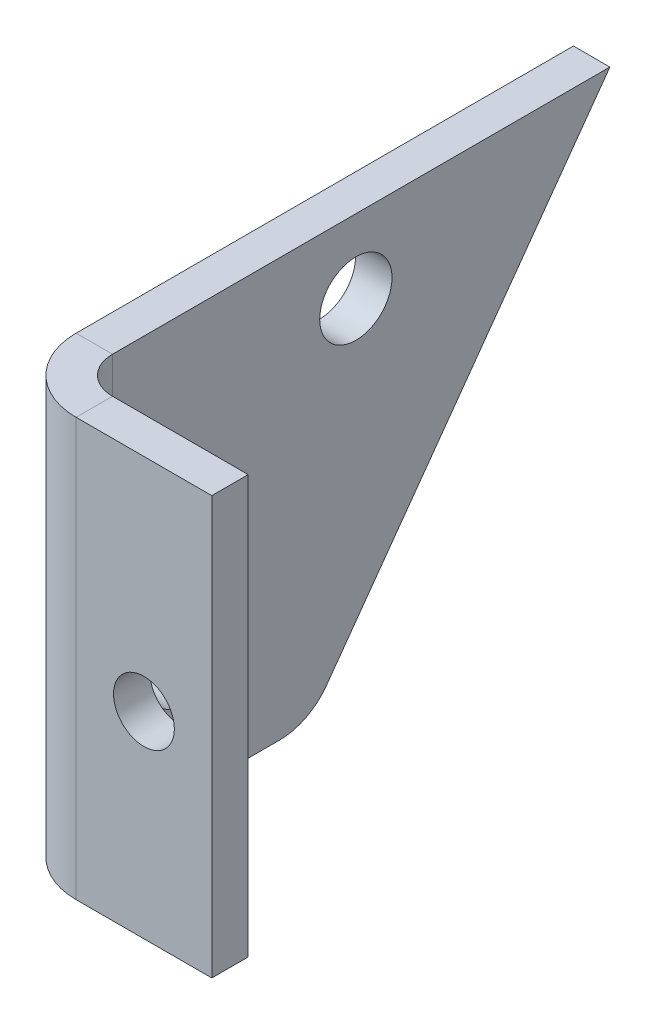
ISO-10303-21;
HEADER;
FILE_DESCRIPTION(('STEP AP214'),'2;1');
FILE_NAME('part.step','',(''),(''),'','','');
FILE_SCHEMA(('AUTOMOTIVE_DESIGN { 1 0 10303 214 1 1 1 1 }'));
ENDSEC;
DATA;
#1=APPLICATION_CONTEXT('core data for automotive mechanical design processes');
#2=APPLICATION_PROTOCOL_DEFINITION('international standard','automotive_design',2000,#1);
#3=PRODUCT_CONTEXT('',#1,'mechanical');
#4=PRODUCT('Part','Part','',(#3));
#5=PRODUCT_RELATED_PRODUCT_CATEGORY('part','',(#4));
#6=PRODUCT_DEFINITION_FORMATION('','',#4);
#7=PRODUCT_DEFINITION_CONTEXT('part definition',#1,'design');
#8=PRODUCT_DEFINITION('design','',#6,#7);
#9=PRODUCT_DEFINITION_SHAPE('','',#8);
#10=(LENGTH_UNIT() NAMED_UNIT(*) SI_UNIT(.MILLI.,.METRE.));
#11=(NAMED_UNIT(*) PLANE_ANGLE_UNIT() SI_UNIT($,.RADIAN.));
#12=(NAMED_UNIT(*) SI_UNIT($,.STERADIAN.) SOLID_ANGLE_UNIT());
#13=UNCERTAINTY_MEASURE_WITH_UNIT(LENGTH_MEASURE(1.E-05),#10,'distance_accuracy_value','');
#14=(GEOMETRIC_REPRESENTATION_CONTEXT(3) GLOBAL_UNCERTAINTY_ASSIGNED_CONTEXT((#13)) GLOBAL_UNIT_ASSIGNED_CONTEXT((#10,
#11,#12)) REPRESENTATION_CONTEXT('',''));
#15=CARTESIAN_POINT('',(0.,0.,0.));
#16=DIRECTION('',(0.,0.,1.));
#17=DIRECTION('',(1.,0.,0.));
#18=AXIS2_PLACEMENT_3D('',#15,#16,#17);
#19=CARTESIAN_POINT('',(-3.175,0.,0.));
#20=DIRECTION('',(0.,-1.,0.));
#21=DIRECTION('',(0.,0.,-1.));
#22=AXIS2_PLACEMENT_3D('',#19,#20,#21);
#23=PLANE('',#22);
#24=DIRECTION('',(0.,0.,-1.));
#25=VECTOR('',#24,1.);
#26=CARTESIAN_POINT('',(0.,0.,0.));
#27=LINE('',#26,#25);
#28=CARTESIAN_POINT('',(0.,0.,-6.34999999999999));
#29=VERTEX_POINT('',#28);
#30=CARTESIAN_POINT('',(0.,0.,-20.9310692511495));
#31=VERTEX_POINT('',#30);
#32=EDGE_CURVE('E237',#29,#31,#27,.T.);
#33=ORIENTED_EDGE('',*,*,#32,.F.);
#34=DIRECTION('',(-1.,0.,0.));
#35=VECTOR('',#34,1.);
#36=CARTESIAN_POINT('',(0.,0.,-6.34999999999999));
#37=LINE('',#36,#35);
#38=CARTESIAN_POINT('',(-3.17500000000001,0.,-6.34999999999999));
#39=VERTEX_POINT('',#38);
#40=EDGE_CURVE('E210',#29,#39,#37,.T.);
#41=ORIENTED_EDGE('',*,*,#40,.T.);
#42=DIRECTION('',(0.,0.,-1.));
#43=VECTOR('',#42,1.);
#44=CARTESIAN_POINT('',(-3.175,0.,0.));
#45=LINE('',#44,#43);
#46=CARTESIAN_POINT('',(-3.175,0.,-20.9310692511495));
#47=VERTEX_POINT('',#46);
#48=EDGE_CURVE('E116',#39,#47,#45,.T.);
#49=ORIENTED_EDGE('',*,*,#48,.T.);
#50=DIRECTION('',(1.,0.,0.));
#51=VECTOR('',#50,1.);
#52=CARTESIAN_POINT('',(-3.175,0.,-20.9310692511495));
#53=LINE('',#52,#51);
#54=EDGE_CURVE('E236',#47,#31,#53,.T.);
#55=ORIENTED_EDGE('',*,*,#54,.T.);
#56=EDGE_LOOP('',(#33,#41,#49,#55));
#57=FACE_BOUND('',#56,.T.);
#58=ADVANCED_FACE('F72',(#57),#23,.T.);
#59=CARTESIAN_POINT('',(-3.175,5.,-20.9310692511495));
#60=DIRECTION('',(1.,0.,0.));
#61=DIRECTION('',(0.,0.,-1.));
#62=AXIS2_PLACEMENT_3D('',#59,#60,#61);
#63=PLANE('',#62);
#64=CARTESIAN_POINT('',(-3.175,10.,-12.5876713691336));
#65=DIRECTION('',(-1.,0.,0.));
#66=DIRECTION('',(0.,0.,1.));
#67=AXIS2_PLACEMENT_3D('',#64,#65,#66);
#68=CIRCLE('',#67,3.15);
#69=CARTESIAN_POINT('',(-3.175,10.,-9.43767136913363));
#70=VERTEX_POINT('',#69);
#71=EDGE_CURVE('E219',#70,#70,#68,.T.);
#72=ORIENTED_EDGE('',*,*,#71,.F.);
#73=EDGE_LOOP('',(#72));
#74=FACE_BOUND('',#73,.T.);
#75=CARTESIAN_POINT('',(-3.175,30.,-27.5538986944384));
#76=DIRECTION('',(-1.,0.,0.));
#77=DIRECTION('',(0.,0.,1.));
#78=AXIS2_PLACEMENT_3D('',#75,#76,#77);
#79=CIRCLE('',#78,3.15);
#80=CARTESIAN_POINT('',(-3.175,30.,-24.4038986944384));
#81=VERTEX_POINT('',#80);
#82=EDGE_CURVE('E221',#81,#81,#79,.T.);
#83=ORIENTED_EDGE('',*,*,#82,.F.);
#84=EDGE_LOOP('',(#83));
#85=FACE_BOUND('',#84,.T.);
#86=DIRECTION('',(0.,-1.,0.));
#87=VECTOR('',#86,1.);
#88=CARTESIAN_POINT('',(-3.17500000000001,0.,-6.34999999999999));
#89=LINE('',#88,#87);
#90=CARTESIAN_POINT('',(-3.175,36.4039753296287,-6.34999999999998));
#91=VERTEX_POINT('',#90);
#92=EDGE_CURVE('E159',#39,#91,#89,.F.);
#93=ORIENTED_EDGE('',*,*,#92,.T.);
#94=DIRECTION('',(0.,0.,1.));
#95=VECTOR('',#94,1.);
#96=CARTESIAN_POINT('',(-3.175,36.4039753296287,0.));
#97=LINE('',#96,#95);
#98=CARTESIAN_POINT('',(-3.175,36.4039753296287,-49.6932453917724));
#99=VERTEX_POINT('',#98);
#100=EDGE_CURVE('E234',#99,#91,#97,.T.);
#101=ORIENTED_EDGE('',*,*,#100,.F.);
#102=DIRECTION('',(0.,0.811644823532769,-0.584151247907988));
#103=VECTOR('',#102,1.);
#104=CARTESIAN_POINT('',(-3.175,2.07924376046009,-24.9892933688134));
#105=LINE('',#104,#103);
#106=CARTESIAN_POINT('',(-3.175,2.07924376046009,-24.9892933688134));
#107=VERTEX_POINT('',#106);
#108=EDGE_CURVE('E232',#107,#99,#105,.T.);
#109=ORIENTED_EDGE('',*,*,#108,.F.);
#110=CARTESIAN_POINT('',(-3.175,5.,-20.9310692511495));
#111=DIRECTION('',(1.,0.,0.));
#112=DIRECTION('',(0.,0.,-1.));
#113=AXIS2_PLACEMENT_3D('',#110,#111,#112);
#114=CIRCLE('',#113,5.00000000000001);
#115=EDGE_CURVE('E228',#47,#107,#114,.T.);
#116=ORIENTED_EDGE('',*,*,#115,.F.);
#117=ORIENTED_EDGE('',*,*,#48,.F.);
#118=EDGE_LOOP('',(#93,#101,#109,#116,#117));
#119=FACE_BOUND('',#118,.T.);
#120=ADVANCED_FACE('F260',(#74,#85,#119),#63,.F.);
#121=CARTESIAN_POINT('',(0.,5.,-20.9310692511495));
#122=DIRECTION('',(1.,0.,0.));
#123=DIRECTION('',(0.,0.,-1.));
#124=AXIS2_PLACEMENT_3D('',#121,#122,#123);
#125=PLANE('',#124);
#126=CARTESIAN_POINT('',(0.,30.,-27.5538986944384));
#127=DIRECTION('',(1.,0.,0.));
#128=DIRECTION('',(0.,0.,-1.));
#129=AXIS2_PLACEMENT_3D('',#126,#127,#128);
#130=CIRCLE('',#129,3.15);
#131=CARTESIAN_POINT('',(0.,30.,-30.7038986944384));
#132=VERTEX_POINT('',#131);
#133=EDGE_CURVE('E75',#132,#132,#130,.T.);
#134=ORIENTED_EDGE('',*,*,#133,.F.);
#135=EDGE_LOOP('',(#134));
#136=FACE_BOUND('',#135,.T.);
#137=CARTESIAN_POINT('',(0.,10.,-12.5876713691336));
#138=DIRECTION('',(1.,0.,0.));
#139=DIRECTION('',(0.,0.,-1.));
#140=AXIS2_PLACEMENT_3D('',#137,#138,#139);
#141=CIRCLE('',#140,3.15);
#142=CARTESIAN_POINT('',(0.,10.,-15.7376713691336));
#143=VERTEX_POINT('',#142);
#144=EDGE_CURVE('E224',#143,#143,#141,.T.);
#145=ORIENTED_EDGE('',*,*,#144,.F.);
#146=EDGE_LOOP('',(#145));
#147=FACE_BOUND('',#146,.T.);
#148=DIRECTION('',(0.,0.,1.));
#149=VECTOR('',#148,1.);
#150=CARTESIAN_POINT('',(0.,36.4039753296287,0.));
#151=LINE('',#150,#149);
#152=CARTESIAN_POINT('',(0.,36.4039753296287,-49.6932453917724));
#153=VERTEX_POINT('',#152);
#154=CARTESIAN_POINT('',(0.,36.4039753296287,-6.34999999999998));
#155=VERTEX_POINT('',#154);
#156=EDGE_CURVE('E229',#153,#155,#151,.T.);
#157=ORIENTED_EDGE('',*,*,#156,.T.);
#158=DIRECTION('',(0.,-1.,0.));
#159=VECTOR('',#158,1.);
#160=CARTESIAN_POINT('',(0.,0.,-6.34999999999999));
#161=LINE('',#160,#159);
#162=EDGE_CURVE('E88',#29,#155,#161,.F.);
#163=ORIENTED_EDGE('',*,*,#162,.F.);
#164=ORIENTED_EDGE('',*,*,#32,.T.);
#165=CARTESIAN_POINT('',(0.,5.,-20.9310692511495));
#166=DIRECTION('',(1.,0.,0.));
#167=DIRECTION('',(0.,0.,-1.));
#168=AXIS2_PLACEMENT_3D('',#165,#166,#167);
#169=CIRCLE('',#168,5.00000000000001);
#170=CARTESIAN_POINT('',(0.,2.07924376046009,-24.9892933688134));
#171=VERTEX_POINT('',#170);
#172=EDGE_CURVE('E239',#31,#171,#169,.T.);
#173=ORIENTED_EDGE('',*,*,#172,.T.);
#174=DIRECTION('',(0.,0.811644823532769,-0.584151247907988));
#175=VECTOR('',#174,1.);
#176=CARTESIAN_POINT('',(0.,2.07924376046009,-24.9892933688134));
#177=LINE('',#176,#175);
#178=EDGE_CURVE('E242',#171,#153,#177,.T.);
#179=ORIENTED_EDGE('',*,*,#178,.T.);
#180=EDGE_LOOP('',(#157,#163,#164,#173,#179));
#181=FACE_BOUND('',#180,.T.);
#182=ADVANCED_FACE('F256',(#136,#147,#181),#125,.T.);
#183=CARTESIAN_POINT('',(-3.175,36.4039753296287,0.));
#184=DIRECTION('',(0.,1.,0.));
#185=DIRECTION('',(0.,0.,1.));
#186=AXIS2_PLACEMENT_3D('',#183,#184,#185);
#187=PLANE('',#186);
#188=DIRECTION('',(-1.,0.,0.));
#189=VECTOR('',#188,1.);
#190=CARTESIAN_POINT('',(0.,36.4039753296287,-6.34999999999998));
#191=LINE('',#190,#189);
#192=EDGE_CURVE('E216',#155,#91,#191,.T.);
#193=ORIENTED_EDGE('',*,*,#192,.F.);
#194=ORIENTED_EDGE('',*,*,#156,.F.);
#195=DIRECTION('',(1.,0.,0.));
#196=VECTOR('',#195,1.);
#197=CARTESIAN_POINT('',(-3.175,36.4039753296287,-49.6932453917724));
#198=LINE('',#197,#196);
#199=EDGE_CURVE('E13',#99,#153,#198,.T.);
#200=ORIENTED_EDGE('',*,*,#199,.F.);
#201=ORIENTED_EDGE('',*,*,#100,.T.);
#202=EDGE_LOOP('',(#193,#194,#200,#201));
#203=FACE_BOUND('',#202,.T.);
#204=ADVANCED_FACE('F259',(#203),#187,.T.);
#205=CARTESIAN_POINT('',(-3.175,2.07924376046009,-24.9892933688134));
#206=DIRECTION('',(0.,-0.584151247907988,-0.811644823532769));
#207=DIRECTION('',(0.,0.81164482353277,-0.584151247907988));
#208=AXIS2_PLACEMENT_3D('',#205,#206,#207);
#209=PLANE('',#208);
#210=ORIENTED_EDGE('',*,*,#178,.F.);
#211=DIRECTION('',(1.,0.,0.));
#212=VECTOR('',#211,1.);
#213=CARTESIAN_POINT('',(-3.175,2.07924376046009,-24.9892933688134));
#214=LINE('',#213,#212);
#215=EDGE_CURVE('E80',#107,#171,#214,.T.);
#216=ORIENTED_EDGE('',*,*,#215,.F.);
#217=ORIENTED_EDGE('',*,*,#108,.T.);
#218=ORIENTED_EDGE('',*,*,#199,.T.);
#219=EDGE_LOOP('',(#210,#216,#217,#218));
#220=FACE_BOUND('',#219,.T.);
#221=ADVANCED_FACE('F309',(#220),#209,.T.);
#222=CARTESIAN_POINT('',(-3.175,5.,-20.9310692511495));
#223=DIRECTION('',(1.,0.,0.));
#224=DIRECTION('',(0.,0.,-1.));
#225=AXIS2_PLACEMENT_3D('',#222,#223,#224);
#226=CYLINDRICAL_SURFACE('',#225,5.00000000000001);
#227=ORIENTED_EDGE('',*,*,#172,.F.);
#228=ORIENTED_EDGE('',*,*,#54,.F.);
#229=ORIENTED_EDGE('',*,*,#115,.T.);
#230=ORIENTED_EDGE('',*,*,#215,.T.);
#231=EDGE_LOOP('',(#227,#228,#229,#230));
#232=FACE_BOUND('',#231,.T.);
#233=ADVANCED_FACE('F306',(#232),#226,.T.);
#234=CARTESIAN_POINT('',(6.825,10.,-12.5876713691336));
#235=DIRECTION('',(-1.,0.,0.));
#236=DIRECTION('',(0.,0.,1.));
#237=AXIS2_PLACEMENT_3D('',#234,#235,#236);
#238=CYLINDRICAL_SURFACE('',#237,3.15);
#239=ORIENTED_EDGE('',*,*,#144,.T.);
#240=EDGE_LOOP('',(#239));
#241=FACE_BOUND('',#240,.T.);
#242=ORIENTED_EDGE('',*,*,#71,.T.);
#243=EDGE_LOOP('',(#242));
#244=FACE_BOUND('',#243,.T.);
#245=ADVANCED_FACE('F315',(#241,#244),#238,.F.);
#246=CARTESIAN_POINT('',(6.825,30.,-27.5538986944384));
#247=DIRECTION('',(-1.,0.,0.));
#248=DIRECTION('',(0.,0.,1.));
#249=AXIS2_PLACEMENT_3D('',#246,#247,#248);
#250=CYLINDRICAL_SURFACE('',#249,3.15);
#251=ORIENTED_EDGE('',*,*,#133,.T.);
#252=EDGE_LOOP('',(#251));
#253=FACE_BOUND('',#252,.T.);
#254=ORIENTED_EDGE('',*,*,#82,.T.);
#255=EDGE_LOOP('',(#254));
#256=FACE_BOUND('',#255,.T.);
#257=ADVANCED_FACE('F253',(#253,#256),#250,.F.);
#258=CARTESIAN_POINT('',(3.17499999999999,36.4039753296287,-6.34999999999999));
#259=DIRECTION('',(0.,1.,0.));
#260=DIRECTION('',(0.,0.,1.));
#261=AXIS2_PLACEMENT_3D('',#258,#259,#260);
#262=PLANE('',#261);
#263=DIRECTION('',(0.,0.,1.));
#264=VECTOR('',#263,1.);
#265=CARTESIAN_POINT('',(3.17499999999999,36.4039753296287,0.));
#266=LINE('',#265,#264);
#267=CARTESIAN_POINT('',(3.17499999999998,36.4039753296287,-3.17499999999999));
#268=VERTEX_POINT('',#267);
#269=CARTESIAN_POINT('',(3.17499999999997,36.4039753296287,0.));
#270=VERTEX_POINT('',#269);
#271=EDGE_CURVE('E204',#268,#270,#266,.T.);
#272=ORIENTED_EDGE('',*,*,#271,.F.);
#273=CARTESIAN_POINT('',(3.17499999999999,36.4039753296287,-6.34999999999999));
#274=DIRECTION('',(0.,-1.,0.));
#275=DIRECTION('',(0.,0.,-1.));
#276=AXIS2_PLACEMENT_3D('',#273,#274,#275);
#277=CIRCLE('',#276,3.175);
#278=EDGE_CURVE('E162',#155,#268,#277,.F.);
#279=ORIENTED_EDGE('',*,*,#278,.F.);
#280=ORIENTED_EDGE('',*,*,#192,.T.);
#281=CARTESIAN_POINT('',(3.17499999999999,36.4039753296287,-6.34999999999999));
#282=DIRECTION('',(0.,-1.,0.));
#283=DIRECTION('',(0.,0.,-1.));
#284=AXIS2_PLACEMENT_3D('',#281,#282,#283);
#285=CIRCLE('',#284,6.35);
#286=EDGE_CURVE('E209',#91,#270,#285,.F.);
#287=ORIENTED_EDGE('',*,*,#286,.T.);
#288=EDGE_LOOP('',(#272,#279,#280,#287));
#289=FACE_BOUND('',#288,.T.);
#290=ADVANCED_FACE('F267',(#289),#262,.T.);
#291=CARTESIAN_POINT('',(3.17499999999999,0.,-6.34999999999999));
#292=DIRECTION('',(0.,1.,0.));
#293=DIRECTION('',(0.,0.,1.));
#294=AXIS2_PLACEMENT_3D('',#291,#292,#293);
#295=PLANE('',#294);
#296=CARTESIAN_POINT('',(3.17499999999999,0.,-6.34999999999999));
#297=DIRECTION('',(0.,-1.,0.));
#298=DIRECTION('',(0.,0.,-1.));
#299=AXIS2_PLACEMENT_3D('',#296,#297,#298);
#300=CIRCLE('',#299,3.175);
#301=CARTESIAN_POINT('',(3.17499999999998,0.,-3.17499999999999));
#302=VERTEX_POINT('',#301);
#303=EDGE_CURVE('E169',#302,#29,#300,.T.);
#304=ORIENTED_EDGE('',*,*,#303,.F.);
#305=DIRECTION('',(0.,0.,1.));
#306=VECTOR('',#305,1.);
#307=CARTESIAN_POINT('',(3.17499999999999,0.,-3.17499999999999));
#308=LINE('',#307,#306);
#309=CARTESIAN_POINT('',(3.17499999999999,0.,0.));
#310=VERTEX_POINT('',#309);
#311=EDGE_CURVE('E166',#302,#310,#308,.T.);
#312=ORIENTED_EDGE('',*,*,#311,.T.);
#313=CARTESIAN_POINT('',(3.17499999999999,0.,-6.34999999999999));
#314=DIRECTION('',(0.,-1.,0.));
#315=DIRECTION('',(0.,0.,-1.));
#316=AXIS2_PLACEMENT_3D('',#313,#314,#315);
#317=CIRCLE('',#316,6.35);
#318=EDGE_CURVE('E152',#310,#39,#317,.T.);
#319=ORIENTED_EDGE('',*,*,#318,.T.);
#320=ORIENTED_EDGE('',*,*,#40,.F.);
#321=EDGE_LOOP('',(#304,#312,#319,#320));
#322=FACE_BOUND('',#321,.T.);
#323=ADVANCED_FACE('F167',(#322),#295,.F.);
#324=CARTESIAN_POINT('',(3.17499999999999,0.,-6.34999999999999));
#325=DIRECTION('',(0.,-1.,0.));
#326=DIRECTION('',(0.,0.,1.));
#327=AXIS2_PLACEMENT_3D('',#324,#325,#326);
#328=CYLINDRICAL_SURFACE('',#327,6.35);
#329=ORIENTED_EDGE('',*,*,#92,.F.);
#330=ORIENTED_EDGE('',*,*,#318,.F.);
#331=DIRECTION('',(0.,-1.,0.));
#332=VECTOR('',#331,1.);
#333=CARTESIAN_POINT('',(3.17499999999999,0.,0.));
#334=LINE('',#333,#332);
#335=EDGE_CURVE('E157',#270,#310,#334,.T.);
#336=ORIENTED_EDGE('',*,*,#335,.F.);
#337=ORIENTED_EDGE('',*,*,#286,.F.);
#338=EDGE_LOOP('',(#329,#330,#336,#337));
#339=FACE_BOUND('',#338,.T.);
#340=ADVANCED_FACE('F154',(#339),#328,.T.);
#341=CARTESIAN_POINT('',(3.17499999999999,0.,-6.34999999999999));
#342=DIRECTION('',(0.,-1.,0.));
#343=DIRECTION('',(0.,0.,1.));
#344=AXIS2_PLACEMENT_3D('',#341,#342,#343);
#345=CYLINDRICAL_SURFACE('',#344,3.175);
#346=ORIENTED_EDGE('',*,*,#162,.T.);
#347=ORIENTED_EDGE('',*,*,#278,.T.);
#348=DIRECTION('',(0.,1.,0.));
#349=VECTOR('',#348,1.);
#350=CARTESIAN_POINT('',(3.17499999999999,36.4039753296287,-3.17499999999999));
#351=LINE('',#350,#349);
#352=EDGE_CURVE('E174',#268,#302,#351,.F.);
#353=ORIENTED_EDGE('',*,*,#352,.T.);
#354=ORIENTED_EDGE('',*,*,#303,.T.);
#355=EDGE_LOOP('',(#346,#347,#353,#354));
#356=FACE_BOUND('',#355,.T.);
#357=ADVANCED_FACE('F264',(#356),#345,.F.);
#358=CARTESIAN_POINT('',(0.,0.,0.));
#359=DIRECTION('',(0.,-1.,0.));
#360=DIRECTION('',(0.,0.,-1.));
#361=AXIS2_PLACEMENT_3D('',#358,#359,#360);
#362=PLANE('',#361);
#363=DIRECTION('',(-1.,0.,0.));
#364=VECTOR('',#363,1.);
#365=CARTESIAN_POINT('',(0.,0.,0.));
#366=LINE('',#365,#364);
#367=CARTESIAN_POINT('',(15.,0.,0.));
#368=VERTEX_POINT('',#367);
#369=EDGE_CURVE('E181',#368,#310,#366,.T.);
#370=ORIENTED_EDGE('',*,*,#369,.T.);
#371=ORIENTED_EDGE('',*,*,#311,.F.);
#372=DIRECTION('',(1.,0.,0.));
#373=VECTOR('',#372,1.);
#374=CARTESIAN_POINT('',(0.,0.,-3.175));
#375=LINE('',#374,#373);
#376=CARTESIAN_POINT('',(15.,0.,-3.17499999999995));
#377=VERTEX_POINT('',#376);
#378=EDGE_CURVE('E197',#377,#302,#375,.F.);
#379=ORIENTED_EDGE('',*,*,#378,.F.);
#380=DIRECTION('',(0.,0.,-1.));
#381=VECTOR('',#380,1.);
#382=CARTESIAN_POINT('',(15.,0.,0.));
#383=LINE('',#382,#381);
#384=EDGE_CURVE('E186',#368,#377,#383,.T.);
#385=ORIENTED_EDGE('',*,*,#384,.F.);
#386=EDGE_LOOP('',(#370,#371,#379,#385));
#387=FACE_BOUND('',#386,.T.);
#388=ADVANCED_FACE('F185',(#387),#362,.T.);
#389=CARTESIAN_POINT('',(15.,36.4039753296287,0.));
#390=DIRECTION('',(0.,1.,0.));
#391=DIRECTION('',(0.,0.,1.));
#392=AXIS2_PLACEMENT_3D('',#389,#390,#391);
#393=PLANE('',#392);
#394=DIRECTION('',(-1.,0.,0.));
#395=VECTOR('',#394,1.);
#396=CARTESIAN_POINT('',(0.,36.4039753296287,-3.175));
#397=LINE('',#396,#395);
#398=CARTESIAN_POINT('',(15.,36.4039753296287,-3.17499999999995));
#399=VERTEX_POINT('',#398);
#400=EDGE_CURVE('E183',#268,#399,#397,.F.);
#401=ORIENTED_EDGE('',*,*,#400,.F.);
#402=ORIENTED_EDGE('',*,*,#271,.T.);
#403=DIRECTION('',(1.,0.,0.));
#404=VECTOR('',#403,1.);
#405=CARTESIAN_POINT('',(15.,36.4039753296287,0.));
#406=LINE('',#405,#404);
#407=CARTESIAN_POINT('',(15.,36.4039753296287,0.));
#408=VERTEX_POINT('',#407);
#409=EDGE_CURVE('E182',#270,#408,#406,.T.);
#410=ORIENTED_EDGE('',*,*,#409,.T.);
#411=DIRECTION('',(0.,0.,-1.));
#412=VECTOR('',#411,1.);
#413=CARTESIAN_POINT('',(15.,36.4039753296287,0.));
#414=LINE('',#413,#412);
#415=EDGE_CURVE('E188',#408,#399,#414,.T.);
#416=ORIENTED_EDGE('',*,*,#415,.T.);
#417=EDGE_LOOP('',(#401,#402,#410,#416));
#418=FACE_BOUND('',#417,.T.);
#419=ADVANCED_FACE('F270',(#418),#393,.T.);
#420=CARTESIAN_POINT('',(0.,0.,0.));
#421=DIRECTION('',(0.,0.,1.));
#422=DIRECTION('',(1.,0.,0.));
#423=AXIS2_PLACEMENT_3D('',#420,#421,#422);
#424=PLANE('',#423);
#425=CARTESIAN_POINT('',(9.0875,17.1622712555925,0.));
#426=DIRECTION('',(0.,0.,1.));
#427=DIRECTION('',(1.,0.,0.));
#428=AXIS2_PLACEMENT_3D('',#425,#426,#427);
#429=CIRCLE('',#428,2.65);
#430=CARTESIAN_POINT('',(11.7375,17.1622712555925,0.));
#431=VERTEX_POINT('',#430);
#432=EDGE_CURVE('E207',#431,#431,#429,.T.);
#433=ORIENTED_EDGE('',*,*,#432,.F.);
#434=EDGE_LOOP('',(#433));
#435=FACE_BOUND('',#434,.T.);
#436=ORIENTED_EDGE('',*,*,#409,.F.);
#437=ORIENTED_EDGE('',*,*,#335,.T.);
#438=ORIENTED_EDGE('',*,*,#369,.F.);
#439=DIRECTION('',(0.,-1.,0.));
#440=VECTOR('',#439,1.);
#441=CARTESIAN_POINT('',(15.,0.,0.));
#442=LINE('',#441,#440);
#443=EDGE_CURVE('E189',#408,#368,#442,.T.);
#444=ORIENTED_EDGE('',*,*,#443,.F.);
#445=EDGE_LOOP('',(#436,#437,#438,#444));
#446=FACE_BOUND('',#445,.T.);
#447=ADVANCED_FACE('F179',(#435,#446),#424,.T.);
#448=CARTESIAN_POINT('',(0.,0.,-3.175));
#449=DIRECTION('',(0.,0.,1.));
#450=DIRECTION('',(1.,0.,0.));
#451=AXIS2_PLACEMENT_3D('',#448,#449,#450);
#452=PLANE('',#451);
#453=CARTESIAN_POINT('',(9.08749999999999,17.1622712555925,-3.17500000000003));
#454=DIRECTION('',(0.,0.,-1.));
#455=DIRECTION('',(-1.,0.,0.));
#456=AXIS2_PLACEMENT_3D('',#453,#454,#455);
#457=CIRCLE('',#456,2.65);
#458=CARTESIAN_POINT('',(6.43749999999999,17.1622712555925,-3.17500000000002));
#459=VERTEX_POINT('',#458);
#460=EDGE_CURVE('E280',#459,#459,#457,.T.);
#461=ORIENTED_EDGE('',*,*,#460,.F.);
#462=EDGE_LOOP('',(#461));
#463=FACE_BOUND('',#462,.T.);
#464=ORIENTED_EDGE('',*,*,#352,.F.);
#465=ORIENTED_EDGE('',*,*,#400,.T.);
#466=DIRECTION('',(0.,1.,0.));
#467=VECTOR('',#466,1.);
#468=CARTESIAN_POINT('',(15.,0.,-3.17499999999995));
#469=LINE('',#468,#467);
#470=EDGE_CURVE('E199',#399,#377,#469,.F.);
#471=ORIENTED_EDGE('',*,*,#470,.T.);
#472=ORIENTED_EDGE('',*,*,#378,.T.);
#473=EDGE_LOOP('',(#464,#465,#471,#472));
#474=FACE_BOUND('',#473,.T.);
#475=ADVANCED_FACE('F274',(#463,#474),#452,.F.);
#476=CARTESIAN_POINT('',(15.,0.,0.));
#477=DIRECTION('',(1.,0.,0.));
#478=DIRECTION('',(0.,0.,-1.));
#479=AXIS2_PLACEMENT_3D('',#476,#477,#478);
#480=PLANE('',#479);
#481=ORIENTED_EDGE('',*,*,#470,.F.);
#482=ORIENTED_EDGE('',*,*,#415,.F.);
#483=ORIENTED_EDGE('',*,*,#443,.T.);
#484=ORIENTED_EDGE('',*,*,#384,.T.);
#485=EDGE_LOOP('',(#481,#482,#483,#484));
#486=FACE_BOUND('',#485,.T.);
#487=ADVANCED_FACE('F276',(#486),#480,.T.);
#488=CARTESIAN_POINT('',(9.08750000000002,17.1622712555925,6.82499999999997));
#489=DIRECTION('',(0.,0.,-1.));
#490=DIRECTION('',(-1.,0.,0.));
#491=AXIS2_PLACEMENT_3D('',#488,#489,#490);
#492=CYLINDRICAL_SURFACE('',#491,2.65);
#493=ORIENTED_EDGE('',*,*,#432,.T.);
#494=EDGE_LOOP('',(#493));
#495=FACE_BOUND('',#494,.T.);
#496=ORIENTED_EDGE('',*,*,#460,.T.);
#497=EDGE_LOOP('',(#496));
#498=FACE_BOUND('',#497,.T.);
#499=ADVANCED_FACE('F284',(#495,#498),#492,.F.);
#500=CLOSED_SHELL('',(#58,#120,#182,#204,#221,#233,#245,#257,#290,#323,#340,#357,#388,#419,#447,
#475,#487,#499));
#501=MANIFOLD_SOLID_BREP('B2',#500);
#502=ADVANCED_BREP_SHAPE_REPRESENTATION('',(#18,#501),#14);
#503=SHAPE_DEFINITION_REPRESENTATION(#9,#502);
ENDSEC;
END-ISO-10303-21;
